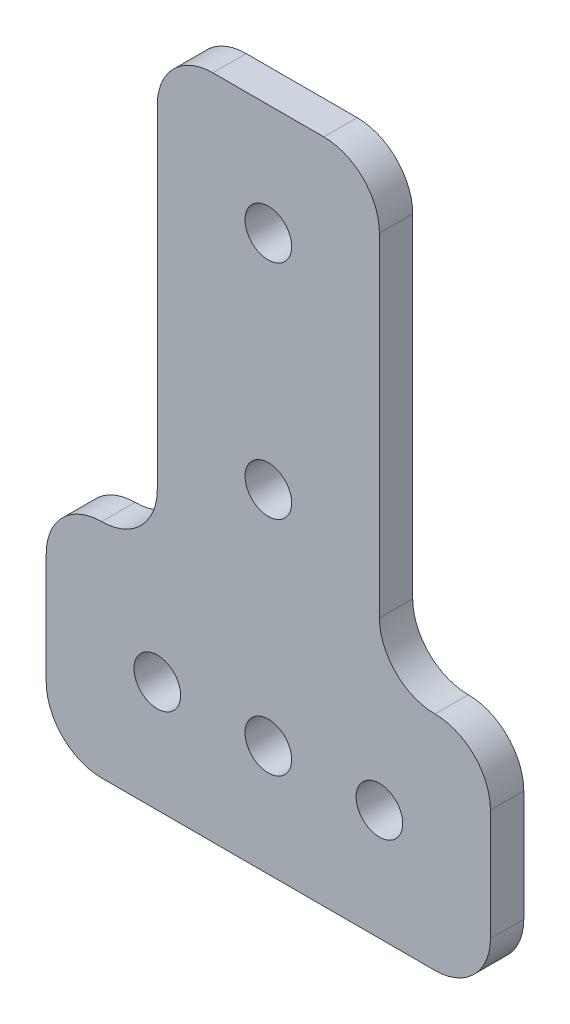
ISO-10303-21;
HEADER;
FILE_DESCRIPTION(('STEP AP214'),'2;1');
FILE_NAME('part.step','',(''),(''),'','','');
FILE_SCHEMA(('AUTOMOTIVE_DESIGN { 1 0 10303 214 1 1 1 1 }'));
ENDSEC;
DATA;
#1=APPLICATION_CONTEXT('core data for automotive mechanical design processes');
#2=APPLICATION_PROTOCOL_DEFINITION('international standard','automotive_design',2000,#1);
#3=PRODUCT_CONTEXT('',#1,'mechanical');
#4=PRODUCT('Part','Part','',(#3));
#5=PRODUCT_RELATED_PRODUCT_CATEGORY('part','',(#4));
#6=PRODUCT_DEFINITION_FORMATION('','',#4);
#7=PRODUCT_DEFINITION_CONTEXT('part definition',#1,'design');
#8=PRODUCT_DEFINITION('design','',#6,#7);
#9=PRODUCT_DEFINITION_SHAPE('','',#8);
#10=(LENGTH_UNIT() NAMED_UNIT(*) SI_UNIT(.MILLI.,.METRE.));
#11=(NAMED_UNIT(*) PLANE_ANGLE_UNIT() SI_UNIT($,.RADIAN.));
#12=(NAMED_UNIT(*) SI_UNIT($,.STERADIAN.) SOLID_ANGLE_UNIT());
#13=UNCERTAINTY_MEASURE_WITH_UNIT(LENGTH_MEASURE(1.E-05),#10,'distance_accuracy_value','');
#14=(GEOMETRIC_REPRESENTATION_CONTEXT(3) GLOBAL_UNCERTAINTY_ASSIGNED_CONTEXT((#13)) GLOBAL_UNIT_ASSIGNED_CONTEXT((#10,
#11,#12)) REPRESENTATION_CONTEXT('',''));
#15=CARTESIAN_POINT('',(0.,0.,0.));
#16=DIRECTION('',(0.,0.,1.));
#17=DIRECTION('',(1.,0.,0.));
#18=AXIS2_PLACEMENT_3D('',#15,#16,#17);
#19=CARTESIAN_POINT('',(0.,0.,3.));
#20=DIRECTION('',(0.,0.,1.));
#21=DIRECTION('',(1.,0.,0.));
#22=AXIS2_PLACEMENT_3D('',#19,#20,#21);
#23=PLANE('',#22);
#24=CARTESIAN_POINT('',(20.,10.,3.));
#25=DIRECTION('',(0.,0.,1.));
#26=DIRECTION('',(1.,0.,0.));
#27=AXIS2_PLACEMENT_3D('',#24,#25,#26);
#28=CIRCLE('',#27,2.1);
#29=CARTESIAN_POINT('',(22.1,10.,3.));
#30=VERTEX_POINT('',#29);
#31=EDGE_CURVE('E365',#30,#30,#28,.T.);
#32=ORIENTED_EDGE('',*,*,#31,.F.);
#33=EDGE_LOOP('',(#32));
#34=FACE_BOUND('',#33,.T.);
#35=CARTESIAN_POINT('',(9.99999999999999,-9.99999999999999,3.));
#36=DIRECTION('',(0.,0.,1.));
#37=DIRECTION('',(1.,0.,0.));
#38=AXIS2_PLACEMENT_3D('',#35,#36,#37);
#39=CIRCLE('',#38,2.1);
#40=CARTESIAN_POINT('',(12.1,-9.99999999999999,3.));
#41=VERTEX_POINT('',#40);
#42=EDGE_CURVE('E381',#41,#41,#39,.T.);
#43=ORIENTED_EDGE('',*,*,#42,.F.);
#44=EDGE_LOOP('',(#43));
#45=FACE_BOUND('',#44,.T.);
#46=DIRECTION('',(0.,-1.,0.));
#47=VECTOR('',#46,1.);
#48=CARTESIAN_POINT('',(0.,0.,3.));
#49=LINE('',#48,#47);
#50=CARTESIAN_POINT('',(0.,-5.,3.));
#51=VERTEX_POINT('',#50);
#52=CARTESIAN_POINT('',(0.,-15.,3.));
#53=VERTEX_POINT('',#52);
#54=EDGE_CURVE('E171',#51,#53,#49,.T.);
#55=ORIENTED_EDGE('',*,*,#54,.T.);
#56=CARTESIAN_POINT('',(5.,-15.,3.));
#57=DIRECTION('',(0.,0.,1.));
#58=DIRECTION('',(1.,0.,0.));
#59=AXIS2_PLACEMENT_3D('',#56,#57,#58);
#60=CIRCLE('',#59,5.);
#61=CARTESIAN_POINT('',(5.,-20.,3.));
#62=VERTEX_POINT('',#61);
#63=EDGE_CURVE('E11',#53,#62,#60,.T.);
#64=ORIENTED_EDGE('',*,*,#63,.T.);
#65=DIRECTION('',(1.,0.,0.));
#66=VECTOR('',#65,1.);
#67=CARTESIAN_POINT('',(0.,-20.,3.));
#68=LINE('',#67,#66);
#69=CARTESIAN_POINT('',(35.,-20.,3.));
#70=VERTEX_POINT('',#69);
#71=EDGE_CURVE('E176',#62,#70,#68,.T.);
#72=ORIENTED_EDGE('',*,*,#71,.T.);
#73=CARTESIAN_POINT('',(35.,-15.,3.));
#74=DIRECTION('',(0.,0.,1.));
#75=DIRECTION('',(1.,0.,0.));
#76=AXIS2_PLACEMENT_3D('',#73,#74,#75);
#77=CIRCLE('',#76,5.);
#78=CARTESIAN_POINT('',(40.,-15.,3.));
#79=VERTEX_POINT('',#78);
#80=EDGE_CURVE('E206',#70,#79,#77,.T.);
#81=ORIENTED_EDGE('',*,*,#80,.T.);
#82=DIRECTION('',(0.,1.,0.));
#83=VECTOR('',#82,1.);
#84=CARTESIAN_POINT('',(40.,0.,3.));
#85=LINE('',#84,#83);
#86=CARTESIAN_POINT('',(40.,-5.,3.));
#87=VERTEX_POINT('',#86);
#88=EDGE_CURVE('E272',#79,#87,#85,.T.);
#89=ORIENTED_EDGE('',*,*,#88,.T.);
#90=CARTESIAN_POINT('',(35.,-5.,3.));
#91=DIRECTION('',(0.,0.,1.));
#92=DIRECTION('',(1.,0.,0.));
#93=AXIS2_PLACEMENT_3D('',#90,#91,#92);
#94=CIRCLE('',#93,5.);
#95=CARTESIAN_POINT('',(35.,0.,3.));
#96=VERTEX_POINT('',#95);
#97=EDGE_CURVE('E203',#87,#96,#94,.T.);
#98=ORIENTED_EDGE('',*,*,#97,.T.);
#99=CARTESIAN_POINT('',(35.,5.,3.));
#100=DIRECTION('',(0.,0.,1.));
#101=DIRECTION('',(1.,0.,0.));
#102=AXIS2_PLACEMENT_3D('',#99,#100,#101);
#103=CIRCLE('',#102,5.);
#104=CARTESIAN_POINT('',(30.,5.,3.));
#105=VERTEX_POINT('',#104);
#106=EDGE_CURVE('E239',#96,#105,#103,.F.);
#107=ORIENTED_EDGE('',*,*,#106,.T.);
#108=DIRECTION('',(0.,1.,0.));
#109=VECTOR('',#108,1.);
#110=CARTESIAN_POINT('',(30.,40.,3.));
#111=LINE('',#110,#109);
#112=CARTESIAN_POINT('',(30.,35.,3.));
#113=VERTEX_POINT('',#112);
#114=EDGE_CURVE('E268',#105,#113,#111,.T.);
#115=ORIENTED_EDGE('',*,*,#114,.T.);
#116=CARTESIAN_POINT('',(25.,35.,3.));
#117=DIRECTION('',(0.,0.,1.));
#118=DIRECTION('',(1.,0.,0.));
#119=AXIS2_PLACEMENT_3D('',#116,#117,#118);
#120=CIRCLE('',#119,5.);
#121=CARTESIAN_POINT('',(25.,40.,3.));
#122=VERTEX_POINT('',#121);
#123=EDGE_CURVE('E209',#113,#122,#120,.T.);
#124=ORIENTED_EDGE('',*,*,#123,.T.);
#125=DIRECTION('',(-1.,0.,0.));
#126=VECTOR('',#125,1.);
#127=CARTESIAN_POINT('',(10.,40.,3.));
#128=LINE('',#127,#126);
#129=CARTESIAN_POINT('',(15.,40.,3.));
#130=VERTEX_POINT('',#129);
#131=EDGE_CURVE('E264',#122,#130,#128,.T.);
#132=ORIENTED_EDGE('',*,*,#131,.T.);
#133=CARTESIAN_POINT('',(15.,35.,3.));
#134=DIRECTION('',(0.,0.,1.));
#135=DIRECTION('',(1.,0.,0.));
#136=AXIS2_PLACEMENT_3D('',#133,#134,#135);
#137=CIRCLE('',#136,5.);
#138=CARTESIAN_POINT('',(10.,35.,3.));
#139=VERTEX_POINT('',#138);
#140=EDGE_CURVE('E212',#130,#139,#137,.T.);
#141=ORIENTED_EDGE('',*,*,#140,.T.);
#142=DIRECTION('',(0.,-1.,0.));
#143=VECTOR('',#142,1.);
#144=CARTESIAN_POINT('',(10.,0.,3.));
#145=LINE('',#144,#143);
#146=CARTESIAN_POINT('',(10.,5.,3.));
#147=VERTEX_POINT('',#146);
#148=EDGE_CURVE('E161',#139,#147,#145,.T.);
#149=ORIENTED_EDGE('',*,*,#148,.T.);
#150=CARTESIAN_POINT('',(5.00000000000001,5.,3.));
#151=DIRECTION('',(0.,0.,1.));
#152=DIRECTION('',(1.,0.,0.));
#153=AXIS2_PLACEMENT_3D('',#150,#151,#152);
#154=CIRCLE('',#153,5.);
#155=CARTESIAN_POINT('',(5.,0.,3.));
#156=VERTEX_POINT('',#155);
#157=EDGE_CURVE('E244',#147,#156,#154,.F.);
#158=ORIENTED_EDGE('',*,*,#157,.T.);
#159=CARTESIAN_POINT('',(5.,-5.,3.));
#160=DIRECTION('',(0.,0.,1.));
#161=DIRECTION('',(1.,0.,0.));
#162=AXIS2_PLACEMENT_3D('',#159,#160,#161);
#163=CIRCLE('',#162,5.);
#164=EDGE_CURVE('E200',#156,#51,#163,.T.);
#165=ORIENTED_EDGE('',*,*,#164,.T.);
#166=EDGE_LOOP('',(#55,#64,#72,#81,#89,#98,#107,#115,#124,#132,#141,#149,#158,#165));
#167=FACE_BOUND('',#166,.T.);
#168=CARTESIAN_POINT('',(20.,-10.,3.));
#169=DIRECTION('',(0.,0.,1.));
#170=DIRECTION('',(1.,0.,0.));
#171=AXIS2_PLACEMENT_3D('',#168,#169,#170);
#172=CIRCLE('',#171,2.1);
#173=CARTESIAN_POINT('',(22.1,-10.,3.));
#174=VERTEX_POINT('',#173);
#175=EDGE_CURVE('E286',#174,#174,#172,.T.);
#176=ORIENTED_EDGE('',*,*,#175,.F.);
#177=EDGE_LOOP('',(#176));
#178=FACE_BOUND('',#177,.T.);
#179=CARTESIAN_POINT('',(30.,-9.99999999999999,3.));
#180=DIRECTION('',(0.,0.,1.));
#181=DIRECTION('',(1.,0.,0.));
#182=AXIS2_PLACEMENT_3D('',#179,#180,#181);
#183=CIRCLE('',#182,2.1);
#184=CARTESIAN_POINT('',(32.1,-9.99999999999999,3.));
#185=VERTEX_POINT('',#184);
#186=EDGE_CURVE('E373',#185,#185,#183,.T.);
#187=ORIENTED_EDGE('',*,*,#186,.F.);
#188=EDGE_LOOP('',(#187));
#189=FACE_BOUND('',#188,.T.);
#190=CARTESIAN_POINT('',(20.,30.,3.));
#191=DIRECTION('',(0.,0.,1.));
#192=DIRECTION('',(1.,0.,0.));
#193=AXIS2_PLACEMENT_3D('',#190,#191,#192);
#194=CIRCLE('',#193,2.1);
#195=CARTESIAN_POINT('',(22.1,30.,3.));
#196=VERTEX_POINT('',#195);
#197=EDGE_CURVE('E355',#196,#196,#194,.T.);
#198=ORIENTED_EDGE('',*,*,#197,.F.);
#199=EDGE_LOOP('',(#198));
#200=FACE_BOUND('',#199,.T.);
#201=ADVANCED_FACE('F38',(#34,#45,#167,#178,#189,#200),#23,.T.);
#202=CARTESIAN_POINT('',(0.,0.,0.));
#203=DIRECTION('',(0.,0.,1.));
#204=DIRECTION('',(1.,0.,0.));
#205=AXIS2_PLACEMENT_3D('',#202,#203,#204);
#206=PLANE('',#205);
#207=DIRECTION('',(1.,0.,0.));
#208=VECTOR('',#207,1.);
#209=CARTESIAN_POINT('',(0.,-20.,0.));
#210=LINE('',#209,#208);
#211=CARTESIAN_POINT('',(5.,-20.,0.));
#212=VERTEX_POINT('',#211);
#213=CARTESIAN_POINT('',(35.,-20.,0.));
#214=VERTEX_POINT('',#213);
#215=EDGE_CURVE('E285',#212,#214,#210,.T.);
#216=ORIENTED_EDGE('',*,*,#215,.F.);
#217=CARTESIAN_POINT('',(5.,-15.,0.));
#218=DIRECTION('',(0.,0.,1.));
#219=DIRECTION('',(1.,0.,0.));
#220=AXIS2_PLACEMENT_3D('',#217,#218,#219);
#221=CIRCLE('',#220,5.);
#222=CARTESIAN_POINT('',(0.,-15.,0.));
#223=VERTEX_POINT('',#222);
#224=EDGE_CURVE('E61',#212,#223,#221,.F.);
#225=ORIENTED_EDGE('',*,*,#224,.T.);
#226=DIRECTION('',(0.,-1.,0.));
#227=VECTOR('',#226,1.);
#228=CARTESIAN_POINT('',(0.,0.,0.));
#229=LINE('',#228,#227);
#230=CARTESIAN_POINT('',(0.,-5.,0.));
#231=VERTEX_POINT('',#230);
#232=EDGE_CURVE('E282',#231,#223,#229,.T.);
#233=ORIENTED_EDGE('',*,*,#232,.F.);
#234=CARTESIAN_POINT('',(5.,-5.,0.));
#235=DIRECTION('',(0.,0.,1.));
#236=DIRECTION('',(1.,0.,0.));
#237=AXIS2_PLACEMENT_3D('',#234,#235,#236);
#238=CIRCLE('',#237,5.);
#239=CARTESIAN_POINT('',(5.,0.,0.));
#240=VERTEX_POINT('',#239);
#241=EDGE_CURVE('E163',#231,#240,#238,.F.);
#242=ORIENTED_EDGE('',*,*,#241,.T.);
#243=CARTESIAN_POINT('',(5.00000000000001,5.,0.));
#244=DIRECTION('',(0.,0.,1.));
#245=DIRECTION('',(1.,0.,0.));
#246=AXIS2_PLACEMENT_3D('',#243,#244,#245);
#247=CIRCLE('',#246,5.);
#248=CARTESIAN_POINT('',(10.,5.,0.));
#249=VERTEX_POINT('',#248);
#250=EDGE_CURVE('E169',#240,#249,#247,.T.);
#251=ORIENTED_EDGE('',*,*,#250,.T.);
#252=DIRECTION('',(0.,-1.,0.));
#253=VECTOR('',#252,1.);
#254=CARTESIAN_POINT('',(10.,0.,0.));
#255=LINE('',#254,#253);
#256=CARTESIAN_POINT('',(10.,35.,0.));
#257=VERTEX_POINT('',#256);
#258=EDGE_CURVE('E158',#257,#249,#255,.T.);
#259=ORIENTED_EDGE('',*,*,#258,.F.);
#260=CARTESIAN_POINT('',(15.,35.,0.));
#261=DIRECTION('',(0.,0.,1.));
#262=DIRECTION('',(1.,0.,0.));
#263=AXIS2_PLACEMENT_3D('',#260,#261,#262);
#264=CIRCLE('',#263,5.);
#265=CARTESIAN_POINT('',(15.,40.,0.));
#266=VERTEX_POINT('',#265);
#267=EDGE_CURVE('E140',#257,#266,#264,.F.);
#268=ORIENTED_EDGE('',*,*,#267,.T.);
#269=DIRECTION('',(-1.,0.,0.));
#270=VECTOR('',#269,1.);
#271=CARTESIAN_POINT('',(10.,40.,0.));
#272=LINE('',#271,#270);
#273=CARTESIAN_POINT('',(25.,40.,0.));
#274=VERTEX_POINT('',#273);
#275=EDGE_CURVE('E172',#274,#266,#272,.T.);
#276=ORIENTED_EDGE('',*,*,#275,.F.);
#277=CARTESIAN_POINT('',(25.,35.,0.));
#278=DIRECTION('',(0.,0.,1.));
#279=DIRECTION('',(1.,0.,0.));
#280=AXIS2_PLACEMENT_3D('',#277,#278,#279);
#281=CIRCLE('',#280,5.);
#282=CARTESIAN_POINT('',(30.,35.,0.));
#283=VERTEX_POINT('',#282);
#284=EDGE_CURVE('E151',#274,#283,#281,.F.);
#285=ORIENTED_EDGE('',*,*,#284,.T.);
#286=DIRECTION('',(0.,1.,0.));
#287=VECTOR('',#286,1.);
#288=CARTESIAN_POINT('',(30.,40.,0.));
#289=LINE('',#288,#287);
#290=CARTESIAN_POINT('',(30.,5.,0.));
#291=VERTEX_POINT('',#290);
#292=EDGE_CURVE('E178',#291,#283,#289,.T.);
#293=ORIENTED_EDGE('',*,*,#292,.F.);
#294=CARTESIAN_POINT('',(35.,5.,0.));
#295=DIRECTION('',(0.,0.,1.));
#296=DIRECTION('',(1.,0.,0.));
#297=AXIS2_PLACEMENT_3D('',#294,#295,#296);
#298=CIRCLE('',#297,5.);
#299=CARTESIAN_POINT('',(35.,0.,0.));
#300=VERTEX_POINT('',#299);
#301=EDGE_CURVE('E236',#291,#300,#298,.T.);
#302=ORIENTED_EDGE('',*,*,#301,.T.);
#303=CARTESIAN_POINT('',(35.,-5.,0.));
#304=DIRECTION('',(0.,0.,1.));
#305=DIRECTION('',(1.,0.,0.));
#306=AXIS2_PLACEMENT_3D('',#303,#304,#305);
#307=CIRCLE('',#306,5.);
#308=CARTESIAN_POINT('',(40.,-5.,0.));
#309=VERTEX_POINT('',#308);
#310=EDGE_CURVE('E186',#300,#309,#307,.F.);
#311=ORIENTED_EDGE('',*,*,#310,.T.);
#312=DIRECTION('',(0.,1.,0.));
#313=VECTOR('',#312,1.);
#314=CARTESIAN_POINT('',(40.,0.,0.));
#315=LINE('',#314,#313);
#316=CARTESIAN_POINT('',(40.,-15.,0.));
#317=VERTEX_POINT('',#316);
#318=EDGE_CURVE('E289',#317,#309,#315,.T.);
#319=ORIENTED_EDGE('',*,*,#318,.F.);
#320=CARTESIAN_POINT('',(35.,-15.,0.));
#321=DIRECTION('',(0.,0.,1.));
#322=DIRECTION('',(1.,0.,0.));
#323=AXIS2_PLACEMENT_3D('',#320,#321,#322);
#324=CIRCLE('',#323,5.);
#325=EDGE_CURVE('E189',#317,#214,#324,.F.);
#326=ORIENTED_EDGE('',*,*,#325,.T.);
#327=EDGE_LOOP('',(#216,#225,#233,#242,#251,#259,#268,#276,#285,#293,#302,#311,#319,#326));
#328=FACE_BOUND('',#327,.T.);
#329=CARTESIAN_POINT('',(20.,-10.,0.));
#330=DIRECTION('',(0.,0.,1.));
#331=DIRECTION('',(1.,0.,0.));
#332=AXIS2_PLACEMENT_3D('',#329,#330,#331);
#333=CIRCLE('',#332,2.1);
#334=CARTESIAN_POINT('',(22.1,-10.,0.));
#335=VERTEX_POINT('',#334);
#336=EDGE_CURVE('E385',#335,#335,#333,.T.);
#337=ORIENTED_EDGE('',*,*,#336,.T.);
#338=EDGE_LOOP('',(#337));
#339=FACE_BOUND('',#338,.T.);
#340=CARTESIAN_POINT('',(9.99999999999999,-9.99999999999999,0.));
#341=DIRECTION('',(0.,0.,1.));
#342=DIRECTION('',(1.,0.,0.));
#343=AXIS2_PLACEMENT_3D('',#340,#341,#342);
#344=CIRCLE('',#343,2.1);
#345=CARTESIAN_POINT('',(12.1,-9.99999999999999,0.));
#346=VERTEX_POINT('',#345);
#347=EDGE_CURVE('E377',#346,#346,#344,.T.);
#348=ORIENTED_EDGE('',*,*,#347,.T.);
#349=EDGE_LOOP('',(#348));
#350=FACE_BOUND('',#349,.T.);
#351=CARTESIAN_POINT('',(30.,-9.99999999999999,0.));
#352=DIRECTION('',(0.,0.,1.));
#353=DIRECTION('',(1.,0.,0.));
#354=AXIS2_PLACEMENT_3D('',#351,#352,#353);
#355=CIRCLE('',#354,2.1);
#356=CARTESIAN_POINT('',(32.1,-9.99999999999999,0.));
#357=VERTEX_POINT('',#356);
#358=EDGE_CURVE('E369',#357,#357,#355,.T.);
#359=ORIENTED_EDGE('',*,*,#358,.T.);
#360=EDGE_LOOP('',(#359));
#361=FACE_BOUND('',#360,.T.);
#362=CARTESIAN_POINT('',(20.,10.,0.));
#363=DIRECTION('',(0.,0.,1.));
#364=DIRECTION('',(1.,0.,0.));
#365=AXIS2_PLACEMENT_3D('',#362,#363,#364);
#366=CIRCLE('',#365,2.1);
#367=CARTESIAN_POINT('',(22.1,10.,0.));
#368=VERTEX_POINT('',#367);
#369=EDGE_CURVE('E362',#368,#368,#366,.T.);
#370=ORIENTED_EDGE('',*,*,#369,.T.);
#371=EDGE_LOOP('',(#370));
#372=FACE_BOUND('',#371,.T.);
#373=CARTESIAN_POINT('',(20.,30.,0.));
#374=DIRECTION('',(0.,0.,1.));
#375=DIRECTION('',(1.,0.,0.));
#376=AXIS2_PLACEMENT_3D('',#373,#374,#375);
#377=CIRCLE('',#376,2.1);
#378=CARTESIAN_POINT('',(22.1,30.,0.));
#379=VERTEX_POINT('',#378);
#380=EDGE_CURVE('E252',#379,#379,#377,.T.);
#381=ORIENTED_EDGE('',*,*,#380,.T.);
#382=EDGE_LOOP('',(#381));
#383=FACE_BOUND('',#382,.T.);
#384=ADVANCED_FACE('F166',(#328,#339,#350,#361,#372,#383),#206,.F.);
#385=CARTESIAN_POINT('',(0.,0.,3.));
#386=DIRECTION('',(1.,0.,0.));
#387=DIRECTION('',(0.,1.,0.));
#388=AXIS2_PLACEMENT_3D('',#385,#386,#387);
#389=PLANE('',#388);
#390=ORIENTED_EDGE('',*,*,#232,.T.);
#391=DIRECTION('',(0.,0.,-1.));
#392=VECTOR('',#391,1.);
#393=CARTESIAN_POINT('',(0.,-15.,3.));
#394=LINE('',#393,#392);
#395=EDGE_CURVE('E47',#223,#53,#394,.F.);
#396=ORIENTED_EDGE('',*,*,#395,.T.);
#397=ORIENTED_EDGE('',*,*,#54,.F.);
#398=DIRECTION('',(0.,0.,-1.));
#399=VECTOR('',#398,1.);
#400=CARTESIAN_POINT('',(0.,-5.,3.));
#401=LINE('',#400,#399);
#402=EDGE_CURVE('E233',#51,#231,#401,.T.);
#403=ORIENTED_EDGE('',*,*,#402,.T.);
#404=EDGE_LOOP('',(#390,#396,#397,#403));
#405=FACE_BOUND('',#404,.T.);
#406=ADVANCED_FACE('F325',(#405),#389,.F.);
#407=CARTESIAN_POINT('',(0.,-20.,3.));
#408=DIRECTION('',(0.,1.,0.));
#409=DIRECTION('',(0.,0.,1.));
#410=AXIS2_PLACEMENT_3D('',#407,#408,#409);
#411=PLANE('',#410);
#412=ORIENTED_EDGE('',*,*,#71,.F.);
#413=DIRECTION('',(0.,0.,-1.));
#414=VECTOR('',#413,1.);
#415=CARTESIAN_POINT('',(5.,-20.,3.));
#416=LINE('',#415,#414);
#417=EDGE_CURVE('E247',#62,#212,#416,.T.);
#418=ORIENTED_EDGE('',*,*,#417,.T.);
#419=ORIENTED_EDGE('',*,*,#215,.T.);
#420=DIRECTION('',(0.,0.,-1.));
#421=VECTOR('',#420,1.);
#422=CARTESIAN_POINT('',(35.,-20.,3.));
#423=LINE('',#422,#421);
#424=EDGE_CURVE('E229',#214,#70,#423,.F.);
#425=ORIENTED_EDGE('',*,*,#424,.T.);
#426=EDGE_LOOP('',(#412,#418,#419,#425));
#427=FACE_BOUND('',#426,.T.);
#428=ADVANCED_FACE('F444',(#427),#411,.F.);
#429=CARTESIAN_POINT('',(40.,0.,3.));
#430=DIRECTION('',(-1.,0.,0.));
#431=DIRECTION('',(0.,0.,1.));
#432=AXIS2_PLACEMENT_3D('',#429,#430,#431);
#433=PLANE('',#432);
#434=ORIENTED_EDGE('',*,*,#88,.F.);
#435=DIRECTION('',(0.,0.,-1.));
#436=VECTOR('',#435,1.);
#437=CARTESIAN_POINT('',(40.,-15.,3.));
#438=LINE('',#437,#436);
#439=EDGE_CURVE('E225',#79,#317,#438,.T.);
#440=ORIENTED_EDGE('',*,*,#439,.T.);
#441=ORIENTED_EDGE('',*,*,#318,.T.);
#442=DIRECTION('',(0.,0.,-1.));
#443=VECTOR('',#442,1.);
#444=CARTESIAN_POINT('',(40.,-5.,3.));
#445=LINE('',#444,#443);
#446=EDGE_CURVE('E221',#309,#87,#445,.F.);
#447=ORIENTED_EDGE('',*,*,#446,.T.);
#448=EDGE_LOOP('',(#434,#440,#441,#447));
#449=FACE_BOUND('',#448,.T.);
#450=ADVANCED_FACE('F317',(#449),#433,.F.);
#451=CARTESIAN_POINT('',(30.,40.,3.));
#452=DIRECTION('',(-1.,0.,0.));
#453=DIRECTION('',(0.,-1.,0.));
#454=AXIS2_PLACEMENT_3D('',#451,#452,#453);
#455=PLANE('',#454);
#456=ORIENTED_EDGE('',*,*,#292,.T.);
#457=DIRECTION('',(0.,0.,-1.));
#458=VECTOR('',#457,1.);
#459=CARTESIAN_POINT('',(30.,35.,3.));
#460=LINE('',#459,#458);
#461=EDGE_CURVE('E218',#283,#113,#460,.F.);
#462=ORIENTED_EDGE('',*,*,#461,.T.);
#463=ORIENTED_EDGE('',*,*,#114,.F.);
#464=DIRECTION('',(0.,0.,-1.));
#465=VECTOR('',#464,1.);
#466=CARTESIAN_POINT('',(30.,5.,0.));
#467=LINE('',#466,#465);
#468=EDGE_CURVE('E215',#105,#291,#467,.T.);
#469=ORIENTED_EDGE('',*,*,#468,.T.);
#470=EDGE_LOOP('',(#456,#462,#463,#469));
#471=FACE_BOUND('',#470,.T.);
#472=ADVANCED_FACE('F297',(#471),#455,.F.);
#473=CARTESIAN_POINT('',(10.,40.,3.));
#474=DIRECTION('',(0.,-1.,0.));
#475=DIRECTION('',(0.,0.,-1.));
#476=AXIS2_PLACEMENT_3D('',#473,#474,#475);
#477=PLANE('',#476);
#478=ORIENTED_EDGE('',*,*,#275,.T.);
#479=DIRECTION('',(0.,0.,-1.));
#480=VECTOR('',#479,1.);
#481=CARTESIAN_POINT('',(15.,40.,3.));
#482=LINE('',#481,#480);
#483=EDGE_CURVE('E145',#266,#130,#482,.F.);
#484=ORIENTED_EDGE('',*,*,#483,.T.);
#485=ORIENTED_EDGE('',*,*,#131,.F.);
#486=DIRECTION('',(0.,0.,-1.));
#487=VECTOR('',#486,1.);
#488=CARTESIAN_POINT('',(25.,40.,3.));
#489=LINE('',#488,#487);
#490=EDGE_CURVE('E150',#122,#274,#489,.T.);
#491=ORIENTED_EDGE('',*,*,#490,.T.);
#492=EDGE_LOOP('',(#478,#484,#485,#491));
#493=FACE_BOUND('',#492,.T.);
#494=ADVANCED_FACE('F308',(#493),#477,.F.);
#495=CARTESIAN_POINT('',(10.,0.,3.));
#496=DIRECTION('',(1.,0.,0.));
#497=DIRECTION('',(0.,0.,-1.));
#498=AXIS2_PLACEMENT_3D('',#495,#496,#497);
#499=PLANE('',#498);
#500=ORIENTED_EDGE('',*,*,#148,.F.);
#501=DIRECTION('',(0.,0.,-1.));
#502=VECTOR('',#501,1.);
#503=CARTESIAN_POINT('',(10.,35.,3.));
#504=LINE('',#503,#502);
#505=EDGE_CURVE('E144',#139,#257,#504,.T.);
#506=ORIENTED_EDGE('',*,*,#505,.T.);
#507=ORIENTED_EDGE('',*,*,#258,.T.);
#508=DIRECTION('',(0.,0.,-1.));
#509=VECTOR('',#508,1.);
#510=CARTESIAN_POINT('',(10.,5.,3.));
#511=LINE('',#510,#509);
#512=EDGE_CURVE('E164',#249,#147,#511,.F.);
#513=ORIENTED_EDGE('',*,*,#512,.T.);
#514=EDGE_LOOP('',(#500,#506,#507,#513));
#515=FACE_BOUND('',#514,.T.);
#516=ADVANCED_FACE('F156',(#515),#499,.F.);
#517=CARTESIAN_POINT('',(20.,-10.,3.));
#518=DIRECTION('',(0.,0.,-1.));
#519=DIRECTION('',(-1.,0.,0.));
#520=AXIS2_PLACEMENT_3D('',#517,#518,#519);
#521=CYLINDRICAL_SURFACE('',#520,2.1);
#522=ORIENTED_EDGE('',*,*,#175,.T.);
#523=EDGE_LOOP('',(#522));
#524=FACE_BOUND('',#523,.T.);
#525=ORIENTED_EDGE('',*,*,#336,.F.);
#526=EDGE_LOOP('',(#525));
#527=FACE_BOUND('',#526,.T.);
#528=ADVANCED_FACE('F315',(#524,#527),#521,.F.);
#529=CARTESIAN_POINT('',(9.99999999999999,-9.99999999999999,3.));
#530=DIRECTION('',(0.,0.,-1.));
#531=DIRECTION('',(-1.,0.,0.));
#532=AXIS2_PLACEMENT_3D('',#529,#530,#531);
#533=CYLINDRICAL_SURFACE('',#532,2.1);
#534=ORIENTED_EDGE('',*,*,#42,.T.);
#535=EDGE_LOOP('',(#534));
#536=FACE_BOUND('',#535,.T.);
#537=ORIENTED_EDGE('',*,*,#347,.F.);
#538=EDGE_LOOP('',(#537));
#539=FACE_BOUND('',#538,.T.);
#540=ADVANCED_FACE('F332',(#536,#539),#533,.F.);
#541=CARTESIAN_POINT('',(30.,-9.99999999999999,3.));
#542=DIRECTION('',(0.,0.,-1.));
#543=DIRECTION('',(-1.,0.,0.));
#544=AXIS2_PLACEMENT_3D('',#541,#542,#543);
#545=CYLINDRICAL_SURFACE('',#544,2.1);
#546=ORIENTED_EDGE('',*,*,#186,.T.);
#547=EDGE_LOOP('',(#546));
#548=FACE_BOUND('',#547,.T.);
#549=ORIENTED_EDGE('',*,*,#358,.F.);
#550=EDGE_LOOP('',(#549));
#551=FACE_BOUND('',#550,.T.);
#552=ADVANCED_FACE('F336',(#548,#551),#545,.F.);
#553=CARTESIAN_POINT('',(20.,10.,3.));
#554=DIRECTION('',(0.,0.,-1.));
#555=DIRECTION('',(-1.,0.,0.));
#556=AXIS2_PLACEMENT_3D('',#553,#554,#555);
#557=CYLINDRICAL_SURFACE('',#556,2.1);
#558=ORIENTED_EDGE('',*,*,#31,.T.);
#559=EDGE_LOOP('',(#558));
#560=FACE_BOUND('',#559,.T.);
#561=ORIENTED_EDGE('',*,*,#369,.F.);
#562=EDGE_LOOP('',(#561));
#563=FACE_BOUND('',#562,.T.);
#564=ADVANCED_FACE('F340',(#560,#563),#557,.F.);
#565=CARTESIAN_POINT('',(20.,30.,3.));
#566=DIRECTION('',(0.,0.,-1.));
#567=DIRECTION('',(-1.,0.,0.));
#568=AXIS2_PLACEMENT_3D('',#565,#566,#567);
#569=CYLINDRICAL_SURFACE('',#568,2.1);
#570=ORIENTED_EDGE('',*,*,#197,.T.);
#571=EDGE_LOOP('',(#570));
#572=FACE_BOUND('',#571,.T.);
#573=ORIENTED_EDGE('',*,*,#380,.F.);
#574=EDGE_LOOP('',(#573));
#575=FACE_BOUND('',#574,.T.);
#576=ADVANCED_FACE('F344',(#572,#575),#569,.F.);
#577=CARTESIAN_POINT('',(15.,35.,3.));
#578=DIRECTION('',(0.,0.,-1.));
#579=DIRECTION('',(-1.,0.,0.));
#580=AXIS2_PLACEMENT_3D('',#577,#578,#579);
#581=CYLINDRICAL_SURFACE('',#580,5.);
#582=ORIENTED_EDGE('',*,*,#140,.F.);
#583=ORIENTED_EDGE('',*,*,#483,.F.);
#584=ORIENTED_EDGE('',*,*,#267,.F.);
#585=ORIENTED_EDGE('',*,*,#505,.F.);
#586=EDGE_LOOP('',(#582,#583,#584,#585));
#587=FACE_BOUND('',#586,.T.);
#588=ADVANCED_FACE('F143',(#587),#581,.T.);
#589=CARTESIAN_POINT('',(25.,35.,3.));
#590=DIRECTION('',(0.,0.,-1.));
#591=DIRECTION('',(-1.,0.,0.));
#592=AXIS2_PLACEMENT_3D('',#589,#590,#591);
#593=CYLINDRICAL_SURFACE('',#592,5.);
#594=ORIENTED_EDGE('',*,*,#123,.F.);
#595=ORIENTED_EDGE('',*,*,#461,.F.);
#596=ORIENTED_EDGE('',*,*,#284,.F.);
#597=ORIENTED_EDGE('',*,*,#490,.F.);
#598=EDGE_LOOP('',(#594,#595,#596,#597));
#599=FACE_BOUND('',#598,.T.);
#600=ADVANCED_FACE('F303',(#599),#593,.T.);
#601=CARTESIAN_POINT('',(35.,-15.,3.));
#602=DIRECTION('',(0.,0.,-1.));
#603=DIRECTION('',(-1.,0.,0.));
#604=AXIS2_PLACEMENT_3D('',#601,#602,#603);
#605=CYLINDRICAL_SURFACE('',#604,5.);
#606=ORIENTED_EDGE('',*,*,#80,.F.);
#607=ORIENTED_EDGE('',*,*,#424,.F.);
#608=ORIENTED_EDGE('',*,*,#325,.F.);
#609=ORIENTED_EDGE('',*,*,#439,.F.);
#610=EDGE_LOOP('',(#606,#607,#608,#609));
#611=FACE_BOUND('',#610,.T.);
#612=ADVANCED_FACE('F412',(#611),#605,.T.);
#613=CARTESIAN_POINT('',(35.,5.,3.));
#614=DIRECTION('',(0.,0.,1.));
#615=DIRECTION('',(1.,0.,0.));
#616=AXIS2_PLACEMENT_3D('',#613,#614,#615);
#617=CYLINDRICAL_SURFACE('',#616,5.);
#618=ORIENTED_EDGE('',*,*,#468,.F.);
#619=ORIENTED_EDGE('',*,*,#106,.F.);
#620=DIRECTION('',(0.,0.,-1.));
#621=VECTOR('',#620,1.);
#622=CARTESIAN_POINT('',(35.,0.,3.));
#623=LINE('',#622,#621);
#624=EDGE_CURVE('E248',#300,#96,#623,.F.);
#625=ORIENTED_EDGE('',*,*,#624,.F.);
#626=ORIENTED_EDGE('',*,*,#301,.F.);
#627=EDGE_LOOP('',(#618,#619,#625,#626));
#628=FACE_BOUND('',#627,.T.);
#629=ADVANCED_FACE('F419',(#628),#617,.F.);
#630=CARTESIAN_POINT('',(35.,-5.,3.));
#631=DIRECTION('',(0.,0.,-1.));
#632=DIRECTION('',(-1.,0.,0.));
#633=AXIS2_PLACEMENT_3D('',#630,#631,#632);
#634=CYLINDRICAL_SURFACE('',#633,5.);
#635=ORIENTED_EDGE('',*,*,#97,.F.);
#636=ORIENTED_EDGE('',*,*,#446,.F.);
#637=ORIENTED_EDGE('',*,*,#310,.F.);
#638=ORIENTED_EDGE('',*,*,#624,.T.);
#639=EDGE_LOOP('',(#635,#636,#637,#638));
#640=FACE_BOUND('',#639,.T.);
#641=ADVANCED_FACE('F421',(#640),#634,.T.);
#642=CARTESIAN_POINT('',(5.,-5.,3.));
#643=DIRECTION('',(0.,0.,-1.));
#644=DIRECTION('',(-1.,0.,0.));
#645=AXIS2_PLACEMENT_3D('',#642,#643,#644);
#646=CYLINDRICAL_SURFACE('',#645,5.);
#647=ORIENTED_EDGE('',*,*,#402,.F.);
#648=ORIENTED_EDGE('',*,*,#164,.F.);
#649=DIRECTION('',(0.,0.,-1.));
#650=VECTOR('',#649,1.);
#651=CARTESIAN_POINT('',(5.,0.,3.));
#652=LINE('',#651,#650);
#653=EDGE_CURVE('E253',#240,#156,#652,.F.);
#654=ORIENTED_EDGE('',*,*,#653,.F.);
#655=ORIENTED_EDGE('',*,*,#241,.F.);
#656=EDGE_LOOP('',(#647,#648,#654,#655));
#657=FACE_BOUND('',#656,.T.);
#658=ADVANCED_FACE('F424',(#657),#646,.T.);
#659=CARTESIAN_POINT('',(5.00000000000001,5.,3.));
#660=DIRECTION('',(0.,0.,1.));
#661=DIRECTION('',(1.,0.,0.));
#662=AXIS2_PLACEMENT_3D('',#659,#660,#661);
#663=CYLINDRICAL_SURFACE('',#662,5.);
#664=ORIENTED_EDGE('',*,*,#157,.F.);
#665=ORIENTED_EDGE('',*,*,#512,.F.);
#666=ORIENTED_EDGE('',*,*,#250,.F.);
#667=ORIENTED_EDGE('',*,*,#653,.T.);
#668=EDGE_LOOP('',(#664,#665,#666,#667));
#669=FACE_BOUND('',#668,.T.);
#670=ADVANCED_FACE('F429',(#669),#663,.F.);
#671=CARTESIAN_POINT('',(5.,-15.,3.));
#672=DIRECTION('',(0.,0.,-1.));
#673=DIRECTION('',(-1.,0.,0.));
#674=AXIS2_PLACEMENT_3D('',#671,#672,#673);
#675=CYLINDRICAL_SURFACE('',#674,5.);
#676=ORIENTED_EDGE('',*,*,#63,.F.);
#677=ORIENTED_EDGE('',*,*,#395,.F.);
#678=ORIENTED_EDGE('',*,*,#224,.F.);
#679=ORIENTED_EDGE('',*,*,#417,.F.);
#680=EDGE_LOOP('',(#676,#677,#678,#679));
#681=FACE_BOUND('',#680,.T.);
#682=ADVANCED_FACE('F40',(#681),#675,.T.);
#683=CLOSED_SHELL('',(#201,#384,#406,#428,#450,#472,#494,#516,#528,#540,#552,#564,#576,#588,
#600,#612,#629,#641,#658,#670,#682));
#684=MANIFOLD_SOLID_BREP('B2',#683);
#685=ADVANCED_BREP_SHAPE_REPRESENTATION('',(#18,#684),#14);
#686=SHAPE_DEFINITION_REPRESENTATION(#9,#685);
ENDSEC;
END-ISO-10303-21;
